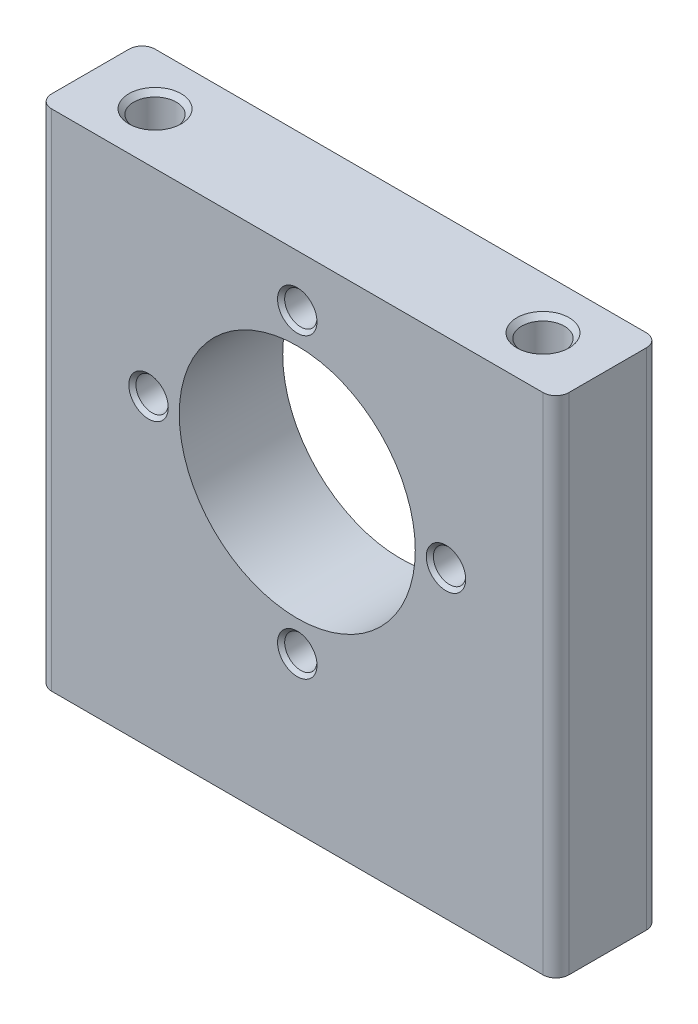
ISO-10303-21;
HEADER;
FILE_DESCRIPTION(('STEP AP214'),'2;1');
FILE_NAME('part.step','',(''),(''),'','','');
FILE_SCHEMA(('AUTOMOTIVE_DESIGN { 1 0 10303 214 1 1 1 1 }'));
ENDSEC;
DATA;
#1=APPLICATION_CONTEXT('core data for automotive mechanical design processes');
#2=APPLICATION_PROTOCOL_DEFINITION('international standard','automotive_design',2000,#1);
#3=PRODUCT_CONTEXT('',#1,'mechanical');
#4=PRODUCT('Part','Part','',(#3));
#5=PRODUCT_RELATED_PRODUCT_CATEGORY('part','',(#4));
#6=PRODUCT_DEFINITION_FORMATION('','',#4);
#7=PRODUCT_DEFINITION_CONTEXT('part definition',#1,'design');
#8=PRODUCT_DEFINITION('design','',#6,#7);
#9=PRODUCT_DEFINITION_SHAPE('','',#8);
#10=(LENGTH_UNIT() NAMED_UNIT(*) SI_UNIT(.MILLI.,.METRE.));
#11=(NAMED_UNIT(*) PLANE_ANGLE_UNIT() SI_UNIT($,.RADIAN.));
#12=(NAMED_UNIT(*) SI_UNIT($,.STERADIAN.) SOLID_ANGLE_UNIT());
#13=UNCERTAINTY_MEASURE_WITH_UNIT(LENGTH_MEASURE(1.E-05),#10,'distance_accuracy_value','');
#14=(GEOMETRIC_REPRESENTATION_CONTEXT(3) GLOBAL_UNCERTAINTY_ASSIGNED_CONTEXT((#13)) GLOBAL_UNIT_ASSIGNED_CONTEXT((#10,
#11,#12)) REPRESENTATION_CONTEXT('',''));
#15=CARTESIAN_POINT('',(0.,0.,0.));
#16=DIRECTION('',(0.,0.,1.));
#17=DIRECTION('',(1.,0.,0.));
#18=AXIS2_PLACEMENT_3D('',#15,#16,#17);
#19=CARTESIAN_POINT('',(20.,39.,-4.));
#20=DIRECTION('',(-1.,0.,0.));
#21=DIRECTION('',(0.,0.,1.));
#22=AXIS2_PLACEMENT_3D('',#19,#20,#21);
#23=PLANE('',#22);
#24=DIRECTION('',(0.,0.,-1.));
#25=VECTOR('',#24,1.);
#26=CARTESIAN_POINT('',(20.,0.,-4.));
#27=LINE('',#26,#25);
#28=CARTESIAN_POINT('',(20.,0.,3.));
#29=VERTEX_POINT('',#28);
#30=CARTESIAN_POINT('',(20.,0.,-3.));
#31=VERTEX_POINT('',#30);
#32=EDGE_CURVE('E182',#29,#31,#27,.T.);
#33=ORIENTED_EDGE('',*,*,#32,.T.);
#34=DIRECTION('',(0.,-1.,0.));
#35=VECTOR('',#34,1.);
#36=CARTESIAN_POINT('',(20.,39.,-3.));
#37=LINE('',#36,#35);
#38=CARTESIAN_POINT('',(20.,39.,-3.));
#39=VERTEX_POINT('',#38);
#40=EDGE_CURVE('E234',#31,#39,#37,.F.);
#41=ORIENTED_EDGE('',*,*,#40,.T.);
#42=DIRECTION('',(0.,0.,-1.));
#43=VECTOR('',#42,1.);
#44=CARTESIAN_POINT('',(20.,39.,-4.));
#45=LINE('',#44,#43);
#46=CARTESIAN_POINT('',(20.,39.,3.));
#47=VERTEX_POINT('',#46);
#48=EDGE_CURVE('E183',#47,#39,#45,.T.);
#49=ORIENTED_EDGE('',*,*,#48,.F.);
#50=DIRECTION('',(0.,-1.,0.));
#51=VECTOR('',#50,1.);
#52=CARTESIAN_POINT('',(20.,39.,3.));
#53=LINE('',#52,#51);
#54=EDGE_CURVE('E230',#47,#29,#53,.T.);
#55=ORIENTED_EDGE('',*,*,#54,.T.);
#56=EDGE_LOOP('',(#33,#41,#49,#55));
#57=FACE_BOUND('',#56,.T.);
#58=ADVANCED_FACE('F41',(#57),#23,.F.);
#59=CARTESIAN_POINT('',(-20.,39.,-4.));
#60=DIRECTION('',(0.,0.,1.));
#61=DIRECTION('',(1.,0.,0.));
#62=AXIS2_PLACEMENT_3D('',#59,#60,#61);
#63=PLANE('',#62);
#64=CARTESIAN_POINT('',(0.,35.,-4.));
#65=DIRECTION('',(0.,0.,1.));
#66=DIRECTION('',(1.,0.,0.));
#67=AXIS2_PLACEMENT_3D('',#64,#65,#66);
#68=CIRCLE('',#67,1.25);
#69=CARTESIAN_POINT('',(1.25,35.,-4.));
#70=VERTEX_POINT('',#69);
#71=EDGE_CURVE('E653',#70,#70,#68,.T.);
#72=ORIENTED_EDGE('',*,*,#71,.T.);
#73=EDGE_LOOP('',(#72));
#74=FACE_BOUND('',#73,.T.);
#75=CARTESIAN_POINT('',(-11.4999999999998,23.5,-4.));
#76=DIRECTION('',(0.,0.,1.));
#77=DIRECTION('',(1.,0.,0.));
#78=AXIS2_PLACEMENT_3D('',#75,#76,#77);
#79=CIRCLE('',#78,1.25);
#80=CARTESIAN_POINT('',(-10.2499999999998,23.5,-4.));
#81=VERTEX_POINT('',#80);
#82=EDGE_CURVE('E643',#81,#81,#79,.T.);
#83=ORIENTED_EDGE('',*,*,#82,.T.);
#84=EDGE_LOOP('',(#83));
#85=FACE_BOUND('',#84,.T.);
#86=CARTESIAN_POINT('',(11.5000000000002,23.5000000000001,-4.));
#87=DIRECTION('',(0.,0.,1.));
#88=DIRECTION('',(1.,0.,0.));
#89=AXIS2_PLACEMENT_3D('',#86,#87,#88);
#90=CIRCLE('',#89,1.25);
#91=CARTESIAN_POINT('',(12.7500000000002,23.5000000000001,-4.));
#92=VERTEX_POINT('',#91);
#93=EDGE_CURVE('E613',#92,#92,#90,.T.);
#94=ORIENTED_EDGE('',*,*,#93,.T.);
#95=EDGE_LOOP('',(#94));
#96=FACE_BOUND('',#95,.T.);
#97=CARTESIAN_POINT('',(2.40912212380176E-13,12.,-4.));
#98=DIRECTION('',(0.,0.,1.));
#99=DIRECTION('',(1.,0.,0.));
#100=AXIS2_PLACEMENT_3D('',#97,#98,#99);
#101=CIRCLE('',#100,1.25);
#102=CARTESIAN_POINT('',(1.25000000000024,12.,-4.));
#103=VERTEX_POINT('',#102);
#104=EDGE_CURVE('E618',#103,#103,#101,.T.);
#105=ORIENTED_EDGE('',*,*,#104,.T.);
#106=EDGE_LOOP('',(#105));
#107=FACE_BOUND('',#106,.T.);
#108=CARTESIAN_POINT('',(0.,23.5,-4.));
#109=DIRECTION('',(0.,0.,1.));
#110=DIRECTION('',(1.,0.,0.));
#111=AXIS2_PLACEMENT_3D('',#108,#109,#110);
#112=CIRCLE('',#111,9.125);
#113=CARTESIAN_POINT('',(9.125,23.5,-4.));
#114=VERTEX_POINT('',#113);
#115=EDGE_CURVE('E154',#114,#114,#112,.T.);
#116=ORIENTED_EDGE('',*,*,#115,.T.);
#117=EDGE_LOOP('',(#116));
#118=FACE_BOUND('',#117,.T.);
#119=DIRECTION('',(-1.,0.,0.));
#120=VECTOR('',#119,1.);
#121=CARTESIAN_POINT('',(-20.,39.,-4.));
#122=LINE('',#121,#120);
#123=CARTESIAN_POINT('',(19.,39.,-4.));
#124=VERTEX_POINT('',#123);
#125=CARTESIAN_POINT('',(-19.,39.,-4.));
#126=VERTEX_POINT('',#125);
#127=EDGE_CURVE('E187',#124,#126,#122,.T.);
#128=ORIENTED_EDGE('',*,*,#127,.F.);
#129=DIRECTION('',(0.,-1.,0.));
#130=VECTOR('',#129,1.);
#131=CARTESIAN_POINT('',(19.,39.,-4.));
#132=LINE('',#131,#130);
#133=CARTESIAN_POINT('',(19.,0.,-4.));
#134=VERTEX_POINT('',#133);
#135=EDGE_CURVE('E214',#124,#134,#132,.T.);
#136=ORIENTED_EDGE('',*,*,#135,.T.);
#137=DIRECTION('',(-1.,0.,0.));
#138=VECTOR('',#137,1.);
#139=CARTESIAN_POINT('',(-20.,0.,-4.));
#140=LINE('',#139,#138);
#141=CARTESIAN_POINT('',(-19.,0.,-4.));
#142=VERTEX_POINT('',#141);
#143=EDGE_CURVE('E202',#134,#142,#140,.T.);
#144=ORIENTED_EDGE('',*,*,#143,.T.);
#145=DIRECTION('',(0.,-1.,0.));
#146=VECTOR('',#145,1.);
#147=CARTESIAN_POINT('',(-19.,39.,-4.));
#148=LINE('',#147,#146);
#149=EDGE_CURVE('E198',#142,#126,#148,.F.);
#150=ORIENTED_EDGE('',*,*,#149,.T.);
#151=EDGE_LOOP('',(#128,#136,#144,#150));
#152=FACE_BOUND('',#151,.T.);
#153=ADVANCED_FACE('F283',(#74,#85,#96,#107,#118,#152),#63,.F.);
#154=CARTESIAN_POINT('',(-20.,39.,-4.));
#155=DIRECTION('',(1.,0.,0.));
#156=DIRECTION('',(0.,0.,-1.));
#157=AXIS2_PLACEMENT_3D('',#154,#155,#156);
#158=PLANE('',#157);
#159=DIRECTION('',(0.,0.,1.));
#160=VECTOR('',#159,1.);
#161=CARTESIAN_POINT('',(-20.,39.,-4.));
#162=LINE('',#161,#160);
#163=CARTESIAN_POINT('',(-20.,39.,-3.));
#164=VERTEX_POINT('',#163);
#165=CARTESIAN_POINT('',(-20.,39.,3.));
#166=VERTEX_POINT('',#165);
#167=EDGE_CURVE('E192',#164,#166,#162,.T.);
#168=ORIENTED_EDGE('',*,*,#167,.F.);
#169=DIRECTION('',(0.,-1.,0.));
#170=VECTOR('',#169,1.);
#171=CARTESIAN_POINT('',(-20.,39.,-3.));
#172=LINE('',#171,#170);
#173=CARTESIAN_POINT('',(-20.,0.,-3.));
#174=VERTEX_POINT('',#173);
#175=EDGE_CURVE('E11',#164,#174,#172,.T.);
#176=ORIENTED_EDGE('',*,*,#175,.T.);
#177=DIRECTION('',(0.,0.,1.));
#178=VECTOR('',#177,1.);
#179=CARTESIAN_POINT('',(-20.,0.,-4.));
#180=LINE('',#179,#178);
#181=CARTESIAN_POINT('',(-20.,0.,3.));
#182=VERTEX_POINT('',#181);
#183=EDGE_CURVE('E206',#174,#182,#180,.T.);
#184=ORIENTED_EDGE('',*,*,#183,.T.);
#185=DIRECTION('',(0.,-1.,0.));
#186=VECTOR('',#185,1.);
#187=CARTESIAN_POINT('',(-20.,39.,3.));
#188=LINE('',#187,#186);
#189=EDGE_CURVE('E50',#182,#166,#188,.F.);
#190=ORIENTED_EDGE('',*,*,#189,.T.);
#191=EDGE_LOOP('',(#168,#176,#184,#190));
#192=FACE_BOUND('',#191,.T.);
#193=ADVANCED_FACE('F257',(#192),#158,.F.);
#194=CARTESIAN_POINT('',(-20.,39.,4.));
#195=DIRECTION('',(0.,0.,-1.));
#196=DIRECTION('',(-1.,0.,0.));
#197=AXIS2_PLACEMENT_3D('',#194,#195,#196);
#198=PLANE('',#197);
#199=CARTESIAN_POINT('',(0.,35.,4.));
#200=DIRECTION('',(0.,0.,1.));
#201=DIRECTION('',(1.,0.,0.));
#202=AXIS2_PLACEMENT_3D('',#199,#200,#201);
#203=CIRCLE('',#202,1.525);
#204=CARTESIAN_POINT('',(1.525,35.,4.));
#205=VERTEX_POINT('',#204);
#206=EDGE_CURVE('E593',#205,#205,#203,.T.);
#207=ORIENTED_EDGE('',*,*,#206,.F.);
#208=EDGE_LOOP('',(#207));
#209=FACE_BOUND('',#208,.T.);
#210=CARTESIAN_POINT('',(-11.4999999999998,23.5,4.));
#211=DIRECTION('',(0.,0.,1.));
#212=DIRECTION('',(1.,0.,0.));
#213=AXIS2_PLACEMENT_3D('',#210,#211,#212);
#214=CIRCLE('',#213,1.525);
#215=CARTESIAN_POINT('',(-9.97499999999984,23.5,4.));
#216=VERTEX_POINT('',#215);
#217=EDGE_CURVE('E597',#216,#216,#214,.T.);
#218=ORIENTED_EDGE('',*,*,#217,.F.);
#219=EDGE_LOOP('',(#218));
#220=FACE_BOUND('',#219,.T.);
#221=CARTESIAN_POINT('',(11.5000000000002,23.5000000000001,4.));
#222=DIRECTION('',(0.,0.,1.));
#223=DIRECTION('',(1.,0.,0.));
#224=AXIS2_PLACEMENT_3D('',#221,#222,#223);
#225=CIRCLE('',#224,1.525);
#226=CARTESIAN_POINT('',(13.0250000000002,23.5000000000001,4.));
#227=VERTEX_POINT('',#226);
#228=EDGE_CURVE('E601',#227,#227,#225,.T.);
#229=ORIENTED_EDGE('',*,*,#228,.F.);
#230=EDGE_LOOP('',(#229));
#231=FACE_BOUND('',#230,.T.);
#232=CARTESIAN_POINT('',(2.40912212380176E-13,12.,4.));
#233=DIRECTION('',(0.,0.,1.));
#234=DIRECTION('',(1.,0.,0.));
#235=AXIS2_PLACEMENT_3D('',#232,#233,#234);
#236=CIRCLE('',#235,1.525);
#237=CARTESIAN_POINT('',(1.52500000000024,12.,4.));
#238=VERTEX_POINT('',#237);
#239=EDGE_CURVE('E605',#238,#238,#236,.T.);
#240=ORIENTED_EDGE('',*,*,#239,.F.);
#241=EDGE_LOOP('',(#240));
#242=FACE_BOUND('',#241,.T.);
#243=CARTESIAN_POINT('',(0.,23.5,4.));
#244=DIRECTION('',(0.,0.,1.));
#245=DIRECTION('',(1.,0.,0.));
#246=AXIS2_PLACEMENT_3D('',#243,#244,#245);
#247=CIRCLE('',#246,9.125);
#248=CARTESIAN_POINT('',(9.125,23.5,4.));
#249=VERTEX_POINT('',#248);
#250=EDGE_CURVE('E150',#249,#249,#247,.T.);
#251=ORIENTED_EDGE('',*,*,#250,.F.);
#252=EDGE_LOOP('',(#251));
#253=FACE_BOUND('',#252,.T.);
#254=DIRECTION('',(1.,0.,0.));
#255=VECTOR('',#254,1.);
#256=CARTESIAN_POINT('',(-20.,0.,4.));
#257=LINE('',#256,#255);
#258=CARTESIAN_POINT('',(-19.,0.,4.));
#259=VERTEX_POINT('',#258);
#260=CARTESIAN_POINT('',(19.,0.,4.));
#261=VERTEX_POINT('',#260);
#262=EDGE_CURVE('E188',#259,#261,#257,.T.);
#263=ORIENTED_EDGE('',*,*,#262,.T.);
#264=DIRECTION('',(0.,-1.,0.));
#265=VECTOR('',#264,1.);
#266=CARTESIAN_POINT('',(19.,39.,4.));
#267=LINE('',#266,#265);
#268=CARTESIAN_POINT('',(19.,39.,4.));
#269=VERTEX_POINT('',#268);
#270=EDGE_CURVE('E57',#261,#269,#267,.F.);
#271=ORIENTED_EDGE('',*,*,#270,.T.);
#272=DIRECTION('',(1.,0.,0.));
#273=VECTOR('',#272,1.);
#274=CARTESIAN_POINT('',(-20.,39.,4.));
#275=LINE('',#274,#273);
#276=CARTESIAN_POINT('',(-19.,39.,4.));
#277=VERTEX_POINT('',#276);
#278=EDGE_CURVE('E195',#277,#269,#275,.T.);
#279=ORIENTED_EDGE('',*,*,#278,.F.);
#280=DIRECTION('',(0.,-1.,0.));
#281=VECTOR('',#280,1.);
#282=CARTESIAN_POINT('',(-19.,39.,4.));
#283=LINE('',#282,#281);
#284=EDGE_CURVE('E248',#277,#259,#283,.T.);
#285=ORIENTED_EDGE('',*,*,#284,.T.);
#286=EDGE_LOOP('',(#263,#271,#279,#285));
#287=FACE_BOUND('',#286,.T.);
#288=ADVANCED_FACE('F265',(#209,#220,#231,#242,#253,#287),#198,.F.);
#289=CARTESIAN_POINT('',(0.,39.,0.));
#290=DIRECTION('',(0.,1.,0.));
#291=DIRECTION('',(0.,0.,1.));
#292=AXIS2_PLACEMENT_3D('',#289,#290,#291);
#293=PLANE('',#292);
#294=CARTESIAN_POINT('',(-15.,39.,0.));
#295=DIRECTION('',(0.,1.,0.));
#296=DIRECTION('',(0.,0.,1.));
#297=AXIS2_PLACEMENT_3D('',#294,#295,#296);
#298=CIRCLE('',#297,2.025);
#299=CARTESIAN_POINT('',(-15.,39.,2.025));
#300=VERTEX_POINT('',#299);
#301=EDGE_CURVE('E158',#300,#300,#298,.T.);
#302=ORIENTED_EDGE('',*,*,#301,.F.);
#303=EDGE_LOOP('',(#302));
#304=FACE_BOUND('',#303,.T.);
#305=CARTESIAN_POINT('',(15.,39.,0.));
#306=DIRECTION('',(0.,1.,0.));
#307=DIRECTION('',(0.,0.,1.));
#308=AXIS2_PLACEMENT_3D('',#305,#306,#307);
#309=CIRCLE('',#308,2.025);
#310=CARTESIAN_POINT('',(15.,39.,2.025));
#311=VERTEX_POINT('',#310);
#312=EDGE_CURVE('E170',#311,#311,#309,.T.);
#313=ORIENTED_EDGE('',*,*,#312,.F.);
#314=EDGE_LOOP('',(#313));
#315=FACE_BOUND('',#314,.T.);
#316=ORIENTED_EDGE('',*,*,#48,.T.);
#317=CARTESIAN_POINT('',(19.,39.,-3.));
#318=DIRECTION('',(0.,1.,0.));
#319=DIRECTION('',(0.,0.,1.));
#320=AXIS2_PLACEMENT_3D('',#317,#318,#319);
#321=CIRCLE('',#320,1.);
#322=EDGE_CURVE('E245',#39,#124,#321,.T.);
#323=ORIENTED_EDGE('',*,*,#322,.T.);
#324=ORIENTED_EDGE('',*,*,#127,.T.);
#325=CARTESIAN_POINT('',(-19.,39.,-3.));
#326=DIRECTION('',(0.,1.,0.));
#327=DIRECTION('',(0.,0.,1.));
#328=AXIS2_PLACEMENT_3D('',#325,#326,#327);
#329=CIRCLE('',#328,1.);
#330=EDGE_CURVE('E239',#126,#164,#329,.T.);
#331=ORIENTED_EDGE('',*,*,#330,.T.);
#332=ORIENTED_EDGE('',*,*,#167,.T.);
#333=CARTESIAN_POINT('',(-19.,39.,3.));
#334=DIRECTION('',(0.,1.,0.));
#335=DIRECTION('',(0.,0.,1.));
#336=AXIS2_PLACEMENT_3D('',#333,#334,#335);
#337=CIRCLE('',#336,1.);
#338=EDGE_CURVE('E64',#166,#277,#337,.T.);
#339=ORIENTED_EDGE('',*,*,#338,.T.);
#340=ORIENTED_EDGE('',*,*,#278,.T.);
#341=CARTESIAN_POINT('',(19.,39.,3.));
#342=DIRECTION('',(0.,1.,0.));
#343=DIRECTION('',(0.,0.,1.));
#344=AXIS2_PLACEMENT_3D('',#341,#342,#343);
#345=CIRCLE('',#344,1.);
#346=EDGE_CURVE('E242',#269,#47,#345,.T.);
#347=ORIENTED_EDGE('',*,*,#346,.T.);
#348=EDGE_LOOP('',(#316,#323,#324,#331,#332,#339,#340,#347));
#349=FACE_BOUND('',#348,.T.);
#350=ADVANCED_FACE('F261',(#304,#315,#349),#293,.T.);
#351=CARTESIAN_POINT('',(0.,0.,0.));
#352=DIRECTION('',(0.,1.,0.));
#353=DIRECTION('',(0.,0.,1.));
#354=AXIS2_PLACEMENT_3D('',#351,#352,#353);
#355=PLANE('',#354);
#356=CARTESIAN_POINT('',(-15.,0.,0.));
#357=DIRECTION('',(0.,-1.,0.));
#358=DIRECTION('',(0.,0.,-1.));
#359=AXIS2_PLACEMENT_3D('',#356,#357,#358);
#360=CIRCLE('',#359,2.025);
#361=CARTESIAN_POINT('',(-15.,0.,-2.025));
#362=VERTEX_POINT('',#361);
#363=EDGE_CURVE('E139',#362,#362,#360,.T.);
#364=ORIENTED_EDGE('',*,*,#363,.F.);
#365=EDGE_LOOP('',(#364));
#366=FACE_BOUND('',#365,.T.);
#367=CARTESIAN_POINT('',(15.,0.,0.));
#368=DIRECTION('',(0.,-1.,0.));
#369=DIRECTION('',(0.,0.,-1.));
#370=AXIS2_PLACEMENT_3D('',#367,#368,#369);
#371=CIRCLE('',#370,2.025);
#372=CARTESIAN_POINT('',(15.,0.,-2.025));
#373=VERTEX_POINT('',#372);
#374=EDGE_CURVE('E130',#373,#373,#371,.T.);
#375=ORIENTED_EDGE('',*,*,#374,.F.);
#376=EDGE_LOOP('',(#375));
#377=FACE_BOUND('',#376,.T.);
#378=ORIENTED_EDGE('',*,*,#143,.F.);
#379=CARTESIAN_POINT('',(19.,0.,-3.));
#380=DIRECTION('',(0.,1.,0.));
#381=DIRECTION('',(0.,0.,1.));
#382=AXIS2_PLACEMENT_3D('',#379,#380,#381);
#383=CIRCLE('',#382,1.);
#384=EDGE_CURVE('E227',#134,#31,#383,.F.);
#385=ORIENTED_EDGE('',*,*,#384,.T.);
#386=ORIENTED_EDGE('',*,*,#32,.F.);
#387=CARTESIAN_POINT('',(19.,0.,3.));
#388=DIRECTION('',(0.,1.,0.));
#389=DIRECTION('',(0.,0.,1.));
#390=AXIS2_PLACEMENT_3D('',#387,#388,#389);
#391=CIRCLE('',#390,1.);
#392=EDGE_CURVE('E224',#29,#261,#391,.F.);
#393=ORIENTED_EDGE('',*,*,#392,.T.);
#394=ORIENTED_EDGE('',*,*,#262,.F.);
#395=CARTESIAN_POINT('',(-19.,0.,3.));
#396=DIRECTION('',(0.,1.,0.));
#397=DIRECTION('',(0.,0.,1.));
#398=AXIS2_PLACEMENT_3D('',#395,#396,#397);
#399=CIRCLE('',#398,1.);
#400=EDGE_CURVE('E218',#259,#182,#399,.F.);
#401=ORIENTED_EDGE('',*,*,#400,.T.);
#402=ORIENTED_EDGE('',*,*,#183,.F.);
#403=CARTESIAN_POINT('',(-19.,0.,-3.));
#404=DIRECTION('',(0.,1.,0.));
#405=DIRECTION('',(0.,0.,1.));
#406=AXIS2_PLACEMENT_3D('',#403,#404,#405);
#407=CIRCLE('',#406,1.);
#408=EDGE_CURVE('E221',#174,#142,#407,.F.);
#409=ORIENTED_EDGE('',*,*,#408,.T.);
#410=EDGE_LOOP('',(#378,#385,#386,#393,#394,#401,#402,#409));
#411=FACE_BOUND('',#410,.T.);
#412=ADVANCED_FACE('F268',(#366,#377,#411),#355,.F.);
#413=CARTESIAN_POINT('',(15.,29.8914200213955,0.));
#414=DIRECTION('',(0.,1.,0.));
#415=DIRECTION('',(0.,0.,1.));
#416=AXIS2_PLACEMENT_3D('',#413,#414,#415);
#417=CONICAL_SURFACE('',#416,1.65,1.02974425867665);
#418=CARTESIAN_POINT('',(15.,28.9,0.));
#419=VERTEX_POINT('',#418);
#420=VERTEX_LOOP('',#419);
#421=FACE_BOUND('',#420,.T.);
#422=CARTESIAN_POINT('',(15.,29.8914200213955,0.));
#423=DIRECTION('',(0.,1.,0.));
#424=DIRECTION('',(0.,0.,1.));
#425=AXIS2_PLACEMENT_3D('',#422,#423,#424);
#426=CIRCLE('',#425,1.65);
#427=CARTESIAN_POINT('',(15.,29.8914200213955,1.64999999999999));
#428=VERTEX_POINT('',#427);
#429=EDGE_CURVE('E178',#428,#428,#426,.T.);
#430=ORIENTED_EDGE('',*,*,#429,.T.);
#431=EDGE_LOOP('',(#430));
#432=FACE_BOUND('',#431,.T.);
#433=ADVANCED_FACE('F382',(#421,#432),#417,.F.);
#434=CARTESIAN_POINT('',(15.,39.,0.));
#435=DIRECTION('',(0.,1.,0.));
#436=DIRECTION('',(0.,0.,1.));
#437=AXIS2_PLACEMENT_3D('',#434,#435,#436);
#438=CYLINDRICAL_SURFACE('',#437,1.65);
#439=ORIENTED_EDGE('',*,*,#429,.F.);
#440=EDGE_LOOP('',(#439));
#441=FACE_BOUND('',#440,.T.);
#442=CARTESIAN_POINT('',(15.,38.625,0.));
#443=DIRECTION('',(0.,1.,0.));
#444=DIRECTION('',(0.,0.,1.));
#445=AXIS2_PLACEMENT_3D('',#442,#443,#444);
#446=CIRCLE('',#445,1.65);
#447=CARTESIAN_POINT('',(15.,38.625,1.65));
#448=VERTEX_POINT('',#447);
#449=EDGE_CURVE('E174',#448,#448,#446,.T.);
#450=ORIENTED_EDGE('',*,*,#449,.T.);
#451=EDGE_LOOP('',(#450));
#452=FACE_BOUND('',#451,.T.);
#453=ADVANCED_FACE('F378',(#441,#452),#438,.F.);
#454=CARTESIAN_POINT('',(15.,39.,0.));
#455=DIRECTION('',(0.,1.,0.));
#456=DIRECTION('',(0.,0.,1.));
#457=AXIS2_PLACEMENT_3D('',#454,#455,#456);
#458=CONICAL_SURFACE('',#457,2.025,0.785398163397448);
#459=ORIENTED_EDGE('',*,*,#449,.F.);
#460=EDGE_LOOP('',(#459));
#461=FACE_BOUND('',#460,.T.);
#462=ORIENTED_EDGE('',*,*,#312,.T.);
#463=EDGE_LOOP('',(#462));
#464=FACE_BOUND('',#463,.T.);
#465=ADVANCED_FACE('F374',(#461,#464),#458,.F.);
#466=CARTESIAN_POINT('',(-15.,29.8914200213955,0.));
#467=DIRECTION('',(0.,1.,0.));
#468=DIRECTION('',(0.,0.,1.));
#469=AXIS2_PLACEMENT_3D('',#466,#467,#468);
#470=CONICAL_SURFACE('',#469,1.65,1.02974425867665);
#471=CARTESIAN_POINT('',(-15.,28.9,0.));
#472=VERTEX_POINT('',#471);
#473=VERTEX_LOOP('',#472);
#474=FACE_BOUND('',#473,.T.);
#475=CARTESIAN_POINT('',(-15.,29.8914200213955,0.));
#476=DIRECTION('',(0.,1.,0.));
#477=DIRECTION('',(0.,0.,1.));
#478=AXIS2_PLACEMENT_3D('',#475,#476,#477);
#479=CIRCLE('',#478,1.65);
#480=CARTESIAN_POINT('',(-15.,29.8914200213955,1.65));
#481=VERTEX_POINT('',#480);
#482=EDGE_CURVE('E166',#481,#481,#479,.T.);
#483=ORIENTED_EDGE('',*,*,#482,.T.);
#484=EDGE_LOOP('',(#483));
#485=FACE_BOUND('',#484,.T.);
#486=ADVANCED_FACE('F370',(#474,#485),#470,.F.);
#487=CARTESIAN_POINT('',(-15.,39.,0.));
#488=DIRECTION('',(0.,1.,0.));
#489=DIRECTION('',(0.,0.,1.));
#490=AXIS2_PLACEMENT_3D('',#487,#488,#489);
#491=CYLINDRICAL_SURFACE('',#490,1.65);
#492=ORIENTED_EDGE('',*,*,#482,.F.);
#493=EDGE_LOOP('',(#492));
#494=FACE_BOUND('',#493,.T.);
#495=CARTESIAN_POINT('',(-15.,38.625,0.));
#496=DIRECTION('',(0.,1.,0.));
#497=DIRECTION('',(0.,0.,1.));
#498=AXIS2_PLACEMENT_3D('',#495,#496,#497);
#499=CIRCLE('',#498,1.65);
#500=CARTESIAN_POINT('',(-15.,38.625,1.65));
#501=VERTEX_POINT('',#500);
#502=EDGE_CURVE('E162',#501,#501,#499,.T.);
#503=ORIENTED_EDGE('',*,*,#502,.T.);
#504=EDGE_LOOP('',(#503));
#505=FACE_BOUND('',#504,.T.);
#506=ADVANCED_FACE('F366',(#494,#505),#491,.F.);
#507=CARTESIAN_POINT('',(-15.,39.,0.));
#508=DIRECTION('',(0.,1.,0.));
#509=DIRECTION('',(0.,0.,1.));
#510=AXIS2_PLACEMENT_3D('',#507,#508,#509);
#511=CONICAL_SURFACE('',#510,2.025,0.785398163397448);
#512=ORIENTED_EDGE('',*,*,#502,.F.);
#513=EDGE_LOOP('',(#512));
#514=FACE_BOUND('',#513,.T.);
#515=ORIENTED_EDGE('',*,*,#301,.T.);
#516=EDGE_LOOP('',(#515));
#517=FACE_BOUND('',#516,.T.);
#518=ADVANCED_FACE('F362',(#514,#517),#511,.F.);
#519=CARTESIAN_POINT('',(0.,23.5,-35.));
#520=DIRECTION('',(0.,0.,1.));
#521=DIRECTION('',(1.,0.,0.));
#522=AXIS2_PLACEMENT_3D('',#519,#520,#521);
#523=CYLINDRICAL_SURFACE('',#522,9.125);
#524=ORIENTED_EDGE('',*,*,#250,.T.);
#525=EDGE_LOOP('',(#524));
#526=FACE_BOUND('',#525,.T.);
#527=ORIENTED_EDGE('',*,*,#115,.F.);
#528=EDGE_LOOP('',(#527));
#529=FACE_BOUND('',#528,.T.);
#530=ADVANCED_FACE('F358',(#526,#529),#523,.F.);
#531=CARTESIAN_POINT('',(15.,9.10857997860453,0.));
#532=DIRECTION('',(0.,-1.,0.));
#533=DIRECTION('',(0.,0.,-1.));
#534=AXIS2_PLACEMENT_3D('',#531,#532,#533);
#535=CONICAL_SURFACE('',#534,1.65,1.02974425867665);
#536=CARTESIAN_POINT('',(15.,10.1,0.));
#537=VERTEX_POINT('',#536);
#538=VERTEX_LOOP('',#537);
#539=FACE_BOUND('',#538,.T.);
#540=CARTESIAN_POINT('',(15.,9.10857997860453,0.));
#541=DIRECTION('',(0.,-1.,0.));
#542=DIRECTION('',(0.,0.,-1.));
#543=AXIS2_PLACEMENT_3D('',#540,#541,#542);
#544=CIRCLE('',#543,1.65);
#545=CARTESIAN_POINT('',(15.,9.10857997860453,-1.65));
#546=VERTEX_POINT('',#545);
#547=EDGE_CURVE('E146',#546,#546,#544,.T.);
#548=ORIENTED_EDGE('',*,*,#547,.T.);
#549=EDGE_LOOP('',(#548));
#550=FACE_BOUND('',#549,.T.);
#551=ADVANCED_FACE('F354',(#539,#550),#535,.F.);
#552=CARTESIAN_POINT('',(15.,0.,0.));
#553=DIRECTION('',(0.,-1.,0.));
#554=DIRECTION('',(0.,0.,-1.));
#555=AXIS2_PLACEMENT_3D('',#552,#553,#554);
#556=CYLINDRICAL_SURFACE('',#555,1.65);
#557=ORIENTED_EDGE('',*,*,#547,.F.);
#558=EDGE_LOOP('',(#557));
#559=FACE_BOUND('',#558,.T.);
#560=CARTESIAN_POINT('',(15.,0.375,0.));
#561=DIRECTION('',(0.,-1.,0.));
#562=DIRECTION('',(0.,0.,-1.));
#563=AXIS2_PLACEMENT_3D('',#560,#561,#562);
#564=CIRCLE('',#563,1.64999999999999);
#565=CARTESIAN_POINT('',(15.,0.375,-1.65));
#566=VERTEX_POINT('',#565);
#567=EDGE_CURVE('E136',#566,#566,#564,.T.);
#568=ORIENTED_EDGE('',*,*,#567,.T.);
#569=EDGE_LOOP('',(#568));
#570=FACE_BOUND('',#569,.T.);
#571=ADVANCED_FACE('F350',(#559,#570),#556,.F.);
#572=CARTESIAN_POINT('',(15.,0.,0.));
#573=DIRECTION('',(0.,-1.,0.));
#574=DIRECTION('',(0.,0.,-1.));
#575=AXIS2_PLACEMENT_3D('',#572,#573,#574);
#576=CONICAL_SURFACE('',#575,2.025,0.785398163397455);
#577=ORIENTED_EDGE('',*,*,#567,.F.);
#578=EDGE_LOOP('',(#577));
#579=FACE_BOUND('',#578,.T.);
#580=ORIENTED_EDGE('',*,*,#374,.T.);
#581=EDGE_LOOP('',(#580));
#582=FACE_BOUND('',#581,.T.);
#583=ADVANCED_FACE('F123',(#579,#582),#576,.F.);
#584=CARTESIAN_POINT('',(-15.,9.10857997860453,0.));
#585=DIRECTION('',(0.,-1.,0.));
#586=DIRECTION('',(0.,0.,-1.));
#587=AXIS2_PLACEMENT_3D('',#584,#585,#586);
#588=CONICAL_SURFACE('',#587,1.65,1.02974425867665);
#589=CARTESIAN_POINT('',(-15.,10.1,0.));
#590=VERTEX_POINT('',#589);
#591=VERTEX_LOOP('',#590);
#592=FACE_BOUND('',#591,.T.);
#593=CARTESIAN_POINT('',(-15.,9.10857997860453,0.));
#594=DIRECTION('',(0.,-1.,0.));
#595=DIRECTION('',(0.,0.,-1.));
#596=AXIS2_PLACEMENT_3D('',#593,#594,#595);
#597=CIRCLE('',#596,1.65);
#598=CARTESIAN_POINT('',(-15.,9.10857997860453,-1.65));
#599=VERTEX_POINT('',#598);
#600=EDGE_CURVE('E127',#599,#599,#597,.T.);
#601=ORIENTED_EDGE('',*,*,#600,.T.);
#602=EDGE_LOOP('',(#601));
#603=FACE_BOUND('',#602,.T.);
#604=ADVANCED_FACE('F119',(#592,#603),#588,.F.);
#605=CARTESIAN_POINT('',(-15.,0.,0.));
#606=DIRECTION('',(0.,-1.,0.));
#607=DIRECTION('',(0.,0.,-1.));
#608=AXIS2_PLACEMENT_3D('',#605,#606,#607);
#609=CYLINDRICAL_SURFACE('',#608,1.64999999999999);
#610=ORIENTED_EDGE('',*,*,#600,.F.);
#611=EDGE_LOOP('',(#610));
#612=FACE_BOUND('',#611,.T.);
#613=CARTESIAN_POINT('',(-15.,0.375,0.));
#614=DIRECTION('',(0.,-1.,0.));
#615=DIRECTION('',(0.,0.,-1.));
#616=AXIS2_PLACEMENT_3D('',#613,#614,#615);
#617=CIRCLE('',#616,1.64999999999999);
#618=CARTESIAN_POINT('',(-15.,0.375,-1.64999999999999));
#619=VERTEX_POINT('',#618);
#620=EDGE_CURVE('E131',#619,#619,#617,.T.);
#621=ORIENTED_EDGE('',*,*,#620,.T.);
#622=EDGE_LOOP('',(#621));
#623=FACE_BOUND('',#622,.T.);
#624=ADVANCED_FACE('F122',(#612,#623),#609,.F.);
#625=CARTESIAN_POINT('',(-15.,0.,0.));
#626=DIRECTION('',(0.,-1.,0.));
#627=DIRECTION('',(0.,0.,-1.));
#628=AXIS2_PLACEMENT_3D('',#625,#626,#627);
#629=CONICAL_SURFACE('',#628,2.025,0.785398163397458);
#630=ORIENTED_EDGE('',*,*,#620,.F.);
#631=EDGE_LOOP('',(#630));
#632=FACE_BOUND('',#631,.T.);
#633=ORIENTED_EDGE('',*,*,#363,.T.);
#634=EDGE_LOOP('',(#633));
#635=FACE_BOUND('',#634,.T.);
#636=ADVANCED_FACE('F341',(#632,#635),#629,.F.);
#637=CARTESIAN_POINT('',(2.40912212380176E-13,12.,4.));
#638=DIRECTION('',(0.,0.,1.));
#639=DIRECTION('',(1.,0.,0.));
#640=AXIS2_PLACEMENT_3D('',#637,#638,#639);
#641=CYLINDRICAL_SURFACE('',#640,1.25);
#642=ORIENTED_EDGE('',*,*,#104,.F.);
#643=EDGE_LOOP('',(#642));
#644=FACE_BOUND('',#643,.T.);
#645=CARTESIAN_POINT('',(2.40912212380176E-13,12.,3.725));
#646=DIRECTION('',(0.,0.,1.));
#647=DIRECTION('',(1.,0.,0.));
#648=AXIS2_PLACEMENT_3D('',#645,#646,#647);
#649=CIRCLE('',#648,1.25);
#650=CARTESIAN_POINT('',(1.25000000000024,12.,3.725));
#651=VERTEX_POINT('',#650);
#652=EDGE_CURVE('E612',#651,#651,#649,.T.);
#653=ORIENTED_EDGE('',*,*,#652,.T.);
#654=EDGE_LOOP('',(#653));
#655=FACE_BOUND('',#654,.T.);
#656=ADVANCED_FACE('F337',(#644,#655),#641,.F.);
#657=CARTESIAN_POINT('',(2.40912212380176E-13,12.,4.));
#658=DIRECTION('',(0.,0.,1.));
#659=DIRECTION('',(1.,0.,0.));
#660=AXIS2_PLACEMENT_3D('',#657,#658,#659);
#661=CONICAL_SURFACE('',#660,1.525,0.785398163397447);
#662=ORIENTED_EDGE('',*,*,#652,.F.);
#663=EDGE_LOOP('',(#662));
#664=FACE_BOUND('',#663,.T.);
#665=ORIENTED_EDGE('',*,*,#239,.T.);
#666=EDGE_LOOP('',(#665));
#667=FACE_BOUND('',#666,.T.);
#668=ADVANCED_FACE('F333',(#664,#667),#661,.F.);
#669=CARTESIAN_POINT('',(11.5000000000002,23.5000000000001,4.));
#670=DIRECTION('',(0.,0.,1.));
#671=DIRECTION('',(1.,0.,0.));
#672=AXIS2_PLACEMENT_3D('',#669,#670,#671);
#673=CYLINDRICAL_SURFACE('',#672,1.25);
#674=ORIENTED_EDGE('',*,*,#93,.F.);
#675=EDGE_LOOP('',(#674));
#676=FACE_BOUND('',#675,.T.);
#677=CARTESIAN_POINT('',(11.5000000000002,23.5000000000001,3.725));
#678=DIRECTION('',(0.,0.,1.));
#679=DIRECTION('',(1.,0.,0.));
#680=AXIS2_PLACEMENT_3D('',#677,#678,#679);
#681=CIRCLE('',#680,1.25);
#682=CARTESIAN_POINT('',(12.7500000000002,23.5000000000001,3.725));
#683=VERTEX_POINT('',#682);
#684=EDGE_CURVE('E621',#683,#683,#681,.T.);
#685=ORIENTED_EDGE('',*,*,#684,.T.);
#686=EDGE_LOOP('',(#685));
#687=FACE_BOUND('',#686,.T.);
#688=ADVANCED_FACE('F329',(#676,#687),#673,.F.);
#689=CARTESIAN_POINT('',(11.5000000000002,23.5000000000001,4.));
#690=DIRECTION('',(0.,0.,1.));
#691=DIRECTION('',(1.,0.,0.));
#692=AXIS2_PLACEMENT_3D('',#689,#690,#691);
#693=CONICAL_SURFACE('',#692,1.525,0.785398163397447);
#694=ORIENTED_EDGE('',*,*,#684,.F.);
#695=EDGE_LOOP('',(#694));
#696=FACE_BOUND('',#695,.T.);
#697=ORIENTED_EDGE('',*,*,#228,.T.);
#698=EDGE_LOOP('',(#697));
#699=FACE_BOUND('',#698,.T.);
#700=ADVANCED_FACE('F325',(#696,#699),#693,.F.);
#701=CARTESIAN_POINT('',(-11.4999999999998,23.5,4.));
#702=DIRECTION('',(0.,0.,1.));
#703=DIRECTION('',(1.,0.,0.));
#704=AXIS2_PLACEMENT_3D('',#701,#702,#703);
#705=CYLINDRICAL_SURFACE('',#704,1.25);
#706=ORIENTED_EDGE('',*,*,#82,.F.);
#707=EDGE_LOOP('',(#706));
#708=FACE_BOUND('',#707,.T.);
#709=CARTESIAN_POINT('',(-11.4999999999998,23.5,3.725));
#710=DIRECTION('',(0.,0.,1.));
#711=DIRECTION('',(1.,0.,0.));
#712=AXIS2_PLACEMENT_3D('',#709,#710,#711);
#713=CIRCLE('',#712,1.25);
#714=CARTESIAN_POINT('',(-10.2499999999998,23.5,3.725));
#715=VERTEX_POINT('',#714);
#716=EDGE_CURVE('E647',#715,#715,#713,.T.);
#717=ORIENTED_EDGE('',*,*,#716,.T.);
#718=EDGE_LOOP('',(#717));
#719=FACE_BOUND('',#718,.T.);
#720=ADVANCED_FACE('F321',(#708,#719),#705,.F.);
#721=CARTESIAN_POINT('',(-11.4999999999998,23.5,4.));
#722=DIRECTION('',(0.,0.,1.));
#723=DIRECTION('',(1.,0.,0.));
#724=AXIS2_PLACEMENT_3D('',#721,#722,#723);
#725=CONICAL_SURFACE('',#724,1.525,0.785398163397447);
#726=ORIENTED_EDGE('',*,*,#716,.F.);
#727=EDGE_LOOP('',(#726));
#728=FACE_BOUND('',#727,.T.);
#729=ORIENTED_EDGE('',*,*,#217,.T.);
#730=EDGE_LOOP('',(#729));
#731=FACE_BOUND('',#730,.T.);
#732=ADVANCED_FACE('F313',(#728,#731),#725,.F.);
#733=CARTESIAN_POINT('',(0.,35.,4.));
#734=DIRECTION('',(0.,0.,1.));
#735=DIRECTION('',(1.,0.,0.));
#736=AXIS2_PLACEMENT_3D('',#733,#734,#735);
#737=CYLINDRICAL_SURFACE('',#736,1.25);
#738=ORIENTED_EDGE('',*,*,#71,.F.);
#739=EDGE_LOOP('',(#738));
#740=FACE_BOUND('',#739,.T.);
#741=CARTESIAN_POINT('',(0.,35.,3.725));
#742=DIRECTION('',(0.,0.,1.));
#743=DIRECTION('',(1.,0.,0.));
#744=AXIS2_PLACEMENT_3D('',#741,#742,#743);
#745=CIRCLE('',#744,1.25);
#746=CARTESIAN_POINT('',(1.25,35.,3.725));
#747=VERTEX_POINT('',#746);
#748=EDGE_CURVE('E657',#747,#747,#745,.T.);
#749=ORIENTED_EDGE('',*,*,#748,.T.);
#750=EDGE_LOOP('',(#749));
#751=FACE_BOUND('',#750,.T.);
#752=ADVANCED_FACE('F307',(#740,#751),#737,.F.);
#753=CARTESIAN_POINT('',(0.,35.,4.));
#754=DIRECTION('',(0.,0.,1.));
#755=DIRECTION('',(1.,0.,0.));
#756=AXIS2_PLACEMENT_3D('',#753,#754,#755);
#757=CONICAL_SURFACE('',#756,1.525,0.785398163397447);
#758=ORIENTED_EDGE('',*,*,#748,.F.);
#759=EDGE_LOOP('',(#758));
#760=FACE_BOUND('',#759,.T.);
#761=ORIENTED_EDGE('',*,*,#206,.T.);
#762=EDGE_LOOP('',(#761));
#763=FACE_BOUND('',#762,.T.);
#764=ADVANCED_FACE('F303',(#760,#763),#757,.F.);
#765=CARTESIAN_POINT('',(19.,39.,-3.));
#766=DIRECTION('',(0.,-1.,0.));
#767=DIRECTION('',(0.,0.,-1.));
#768=AXIS2_PLACEMENT_3D('',#765,#766,#767);
#769=CYLINDRICAL_SURFACE('',#768,1.);
#770=ORIENTED_EDGE('',*,*,#322,.F.);
#771=ORIENTED_EDGE('',*,*,#40,.F.);
#772=ORIENTED_EDGE('',*,*,#384,.F.);
#773=ORIENTED_EDGE('',*,*,#135,.F.);
#774=EDGE_LOOP('',(#770,#771,#772,#773));
#775=FACE_BOUND('',#774,.T.);
#776=ADVANCED_FACE('F281',(#775),#769,.T.);
#777=CARTESIAN_POINT('',(19.,39.,3.));
#778=DIRECTION('',(0.,-1.,0.));
#779=DIRECTION('',(0.,0.,-1.));
#780=AXIS2_PLACEMENT_3D('',#777,#778,#779);
#781=CYLINDRICAL_SURFACE('',#780,1.);
#782=ORIENTED_EDGE('',*,*,#346,.F.);
#783=ORIENTED_EDGE('',*,*,#270,.F.);
#784=ORIENTED_EDGE('',*,*,#392,.F.);
#785=ORIENTED_EDGE('',*,*,#54,.F.);
#786=EDGE_LOOP('',(#782,#783,#784,#785));
#787=FACE_BOUND('',#786,.T.);
#788=ADVANCED_FACE('F273',(#787),#781,.T.);
#789=CARTESIAN_POINT('',(-19.,39.,-3.));
#790=DIRECTION('',(0.,-1.,0.));
#791=DIRECTION('',(0.,0.,-1.));
#792=AXIS2_PLACEMENT_3D('',#789,#790,#791);
#793=CYLINDRICAL_SURFACE('',#792,1.);
#794=ORIENTED_EDGE('',*,*,#330,.F.);
#795=ORIENTED_EDGE('',*,*,#149,.F.);
#796=ORIENTED_EDGE('',*,*,#408,.F.);
#797=ORIENTED_EDGE('',*,*,#175,.F.);
#798=EDGE_LOOP('',(#794,#795,#796,#797));
#799=FACE_BOUND('',#798,.T.);
#800=ADVANCED_FACE('F286',(#799),#793,.T.);
#801=CARTESIAN_POINT('',(-19.,39.,3.));
#802=DIRECTION('',(0.,-1.,0.));
#803=DIRECTION('',(0.,0.,-1.));
#804=AXIS2_PLACEMENT_3D('',#801,#802,#803);
#805=CYLINDRICAL_SURFACE('',#804,1.);
#806=ORIENTED_EDGE('',*,*,#338,.F.);
#807=ORIENTED_EDGE('',*,*,#189,.F.);
#808=ORIENTED_EDGE('',*,*,#400,.F.);
#809=ORIENTED_EDGE('',*,*,#284,.F.);
#810=EDGE_LOOP('',(#806,#807,#808,#809));
#811=FACE_BOUND('',#810,.T.);
#812=ADVANCED_FACE('F43',(#811),#805,.T.);
#813=CLOSED_SHELL('',(#58,#153,#193,#288,#350,#412,#433,#453,#465,#486,#506,#518,#530,#551,#571,
#583,#604,#624,#636,#656,#668,#688,#700,#720,#732,#752,#764,#776,#788,#800,#812));
#814=MANIFOLD_SOLID_BREP('B2',#813);
#815=ADVANCED_BREP_SHAPE_REPRESENTATION('',(#18,#814),#14);
#816=SHAPE_DEFINITION_REPRESENTATION(#9,#815);
ENDSEC;
END-ISO-10303-21;
